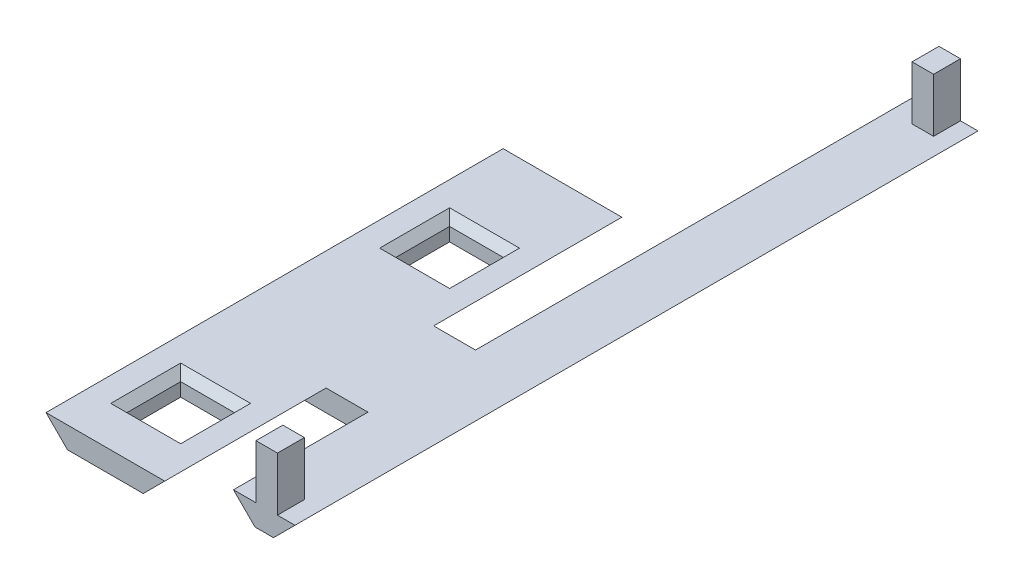
ISO-10303-21;
HEADER;
FILE_DESCRIPTION(('STEP AP214'),'2;1');
FILE_NAME('part.step','',(''),(''),'','','');
FILE_SCHEMA(('AUTOMOTIVE_DESIGN { 1 0 10303 214 1 1 1 1 }'));
ENDSEC;
DATA;
#1=APPLICATION_CONTEXT('core data for automotive mechanical design processes');
#2=APPLICATION_PROTOCOL_DEFINITION('international standard','automotive_design',2000,#1);
#3=PRODUCT_CONTEXT('',#1,'mechanical');
#4=PRODUCT('Part','Part','',(#3));
#5=PRODUCT_RELATED_PRODUCT_CATEGORY('part','',(#4));
#6=PRODUCT_DEFINITION_FORMATION('','',#4);
#7=PRODUCT_DEFINITION_CONTEXT('part definition',#1,'design');
#8=PRODUCT_DEFINITION('design','',#6,#7);
#9=PRODUCT_DEFINITION_SHAPE('','',#8);
#10=(LENGTH_UNIT() NAMED_UNIT(*) SI_UNIT(.MILLI.,.METRE.));
#11=(NAMED_UNIT(*) PLANE_ANGLE_UNIT() SI_UNIT($,.RADIAN.));
#12=(NAMED_UNIT(*) SI_UNIT($,.STERADIAN.) SOLID_ANGLE_UNIT());
#13=UNCERTAINTY_MEASURE_WITH_UNIT(LENGTH_MEASURE(1.E-05),#10,'distance_accuracy_value','');
#14=(GEOMETRIC_REPRESENTATION_CONTEXT(3) GLOBAL_UNCERTAINTY_ASSIGNED_CONTEXT((#13)) GLOBAL_UNIT_ASSIGNED_CONTEXT((#10,
#11,#12)) REPRESENTATION_CONTEXT('',''));
#15=CARTESIAN_POINT('',(0.,0.,0.));
#16=DIRECTION('',(0.,0.,1.));
#17=DIRECTION('',(1.,0.,0.));
#18=AXIS2_PLACEMENT_3D('',#15,#16,#17);
#19=CARTESIAN_POINT('',(0.,4.,85.));
#20=DIRECTION('',(0.,1.,0.));
#21=DIRECTION('',(-1.,0.,0.));
#22=AXIS2_PLACEMENT_3D('',#19,#20,#21);
#23=PLANE('',#22);
#24=DIRECTION('',(1.,0.,0.));
#25=VECTOR('',#24,1.);
#26=CARTESIAN_POINT('',(5.46065409578525,4.,14.5));
#27=LINE('',#26,#25);
#28=CARTESIAN_POINT('',(-6.03934590421478,4.,14.5));
#29=VERTEX_POINT('',#28);
#30=CARTESIAN_POINT('',(6.96065409578528,4.,14.5));
#31=VERTEX_POINT('',#30);
#32=EDGE_CURVE('E460',#29,#31,#27,.T.);
#33=ORIENTED_EDGE('',*,*,#32,.T.);
#34=DIRECTION('',(0.,0.,1.));
#35=VECTOR('',#34,1.);
#36=CARTESIAN_POINT('',(6.96065409578528,4.,26.));
#37=LINE('',#36,#35);
#38=CARTESIAN_POINT('',(6.96065409578528,4.,27.5));
#39=VERTEX_POINT('',#38);
#40=EDGE_CURVE('E462',#31,#39,#37,.T.);
#41=ORIENTED_EDGE('',*,*,#40,.T.);
#42=DIRECTION('',(-1.,0.,0.));
#43=VECTOR('',#42,1.);
#44=CARTESIAN_POINT('',(-4.53934590421476,4.,27.5));
#45=LINE('',#44,#43);
#46=CARTESIAN_POINT('',(-6.03934590421478,4.,27.5));
#47=VERTEX_POINT('',#46);
#48=EDGE_CURVE('E456',#39,#47,#45,.T.);
#49=ORIENTED_EDGE('',*,*,#48,.T.);
#50=DIRECTION('',(0.,0.,-1.));
#51=VECTOR('',#50,1.);
#52=CARTESIAN_POINT('',(-6.03934590421478,4.,16.));
#53=LINE('',#52,#51);
#54=EDGE_CURVE('E458',#47,#29,#53,.T.);
#55=ORIENTED_EDGE('',*,*,#54,.T.);
#56=EDGE_LOOP('',(#33,#41,#49,#55));
#57=FACE_BOUND('',#56,.T.);
#58=DIRECTION('',(0.,0.,-1.));
#59=VECTOR('',#58,1.);
#60=CARTESIAN_POINT('',(-6.03934590421478,4.,66.));
#61=LINE('',#60,#59);
#62=CARTESIAN_POINT('',(-6.03934590421478,4.,77.5));
#63=VERTEX_POINT('',#62);
#64=CARTESIAN_POINT('',(-6.03934590421478,4.,64.5));
#65=VERTEX_POINT('',#64);
#66=EDGE_CURVE('E447',#63,#65,#61,.T.);
#67=ORIENTED_EDGE('',*,*,#66,.T.);
#68=DIRECTION('',(1.,0.,0.));
#69=VECTOR('',#68,1.);
#70=CARTESIAN_POINT('',(5.46065409578524,4.,64.5));
#71=LINE('',#70,#69);
#72=CARTESIAN_POINT('',(6.96065409578526,4.,64.5));
#73=VERTEX_POINT('',#72);
#74=EDGE_CURVE('E453',#65,#73,#71,.T.);
#75=ORIENTED_EDGE('',*,*,#74,.T.);
#76=DIRECTION('',(0.,0.,1.));
#77=VECTOR('',#76,1.);
#78=CARTESIAN_POINT('',(6.96065409578525,4.,76.));
#79=LINE('',#78,#77);
#80=CARTESIAN_POINT('',(6.96065409578525,4.,77.5));
#81=VERTEX_POINT('',#80);
#82=EDGE_CURVE('E451',#73,#81,#79,.T.);
#83=ORIENTED_EDGE('',*,*,#82,.T.);
#84=DIRECTION('',(-1.,0.,0.));
#85=VECTOR('',#84,1.);
#86=CARTESIAN_POINT('',(-4.53934590421476,4.,77.5));
#87=LINE('',#86,#85);
#88=EDGE_CURVE('E449',#81,#63,#87,.T.);
#89=ORIENTED_EDGE('',*,*,#88,.T.);
#90=EDGE_LOOP('',(#67,#75,#83,#89));
#91=FACE_BOUND('',#90,.T.);
#92=DIRECTION('',(1.,0.,0.));
#93=VECTOR('',#92,1.);
#94=CARTESIAN_POINT('',(27.4606540957853,4.,-42.));
#95=LINE('',#94,#93);
#96=CARTESIAN_POINT('',(23.4606540957853,4.,-42.));
#97=VERTEX_POINT('',#96);
#98=CARTESIAN_POINT('',(27.4606540957853,4.,-42.));
#99=VERTEX_POINT('',#98);
#100=EDGE_CURVE('E961',#97,#99,#95,.T.);
#101=ORIENTED_EDGE('',*,*,#100,.F.);
#102=DIRECTION('',(0.,0.,1.));
#103=VECTOR('',#102,1.);
#104=CARTESIAN_POINT('',(23.4606540957853,4.,-42.));
#105=LINE('',#104,#103);
#106=CARTESIAN_POINT('',(23.4606540957853,4.,-47.));
#107=VERTEX_POINT('',#106);
#108=EDGE_CURVE('E275',#107,#97,#105,.T.);
#109=ORIENTED_EDGE('',*,*,#108,.F.);
#110=DIRECTION('',(1.,0.,0.));
#111=VECTOR('',#110,1.);
#112=CARTESIAN_POINT('',(0.,4.,-47.));
#113=LINE('',#112,#111);
#114=CARTESIAN_POINT('',(19.2828427124746,4.,-47.));
#115=VERTEX_POINT('',#114);
#116=EDGE_CURVE('E327',#115,#107,#113,.T.);
#117=ORIENTED_EDGE('',*,*,#116,.F.);
#118=DIRECTION('',(0.,0.,1.));
#119=VECTOR('',#118,1.);
#120=CARTESIAN_POINT('',(19.2828427124746,4.,-47.));
#121=LINE('',#120,#119);
#122=CARTESIAN_POINT('',(19.2828427124746,4.,35.));
#123=VERTEX_POINT('',#122);
#124=EDGE_CURVE('E344',#115,#123,#121,.T.);
#125=ORIENTED_EDGE('',*,*,#124,.T.);
#126=DIRECTION('',(1.,0.,0.));
#127=VECTOR('',#126,1.);
#128=CARTESIAN_POINT('',(7.5,4.,35.));
#129=LINE('',#128,#127);
#130=CARTESIAN_POINT('',(11.5,4.,35.));
#131=VERTEX_POINT('',#130);
#132=EDGE_CURVE('E356',#131,#123,#129,.T.);
#133=ORIENTED_EDGE('',*,*,#132,.F.);
#134=DIRECTION('',(0.,0.,-1.));
#135=VECTOR('',#134,1.);
#136=CARTESIAN_POINT('',(11.5,4.,85.));
#137=LINE('',#136,#135);
#138=CARTESIAN_POINT('',(11.5,4.,0.));
#139=VERTEX_POINT('',#138);
#140=EDGE_CURVE('E437',#131,#139,#137,.T.);
#141=ORIENTED_EDGE('',*,*,#140,.T.);
#142=DIRECTION('',(1.,0.,0.));
#143=VECTOR('',#142,1.);
#144=CARTESIAN_POINT('',(0.,4.,0.));
#145=LINE('',#144,#143);
#146=CARTESIAN_POINT('',(-10.5786918084295,4.,0.));
#147=VERTEX_POINT('',#146);
#148=EDGE_CURVE('E429',#147,#139,#145,.T.);
#149=ORIENTED_EDGE('',*,*,#148,.F.);
#150=DIRECTION('',(0.,0.,-1.));
#151=VECTOR('',#150,1.);
#152=CARTESIAN_POINT('',(-10.5786918084295,4.,85.));
#153=LINE('',#152,#151);
#154=CARTESIAN_POINT('',(-10.5786918084295,4.,85.));
#155=VERTEX_POINT('',#154);
#156=EDGE_CURVE('E435',#155,#147,#153,.T.);
#157=ORIENTED_EDGE('',*,*,#156,.F.);
#158=DIRECTION('',(1.,0.,0.));
#159=VECTOR('',#158,1.);
#160=CARTESIAN_POINT('',(0.,4.,85.));
#161=LINE('',#160,#159);
#162=CARTESIAN_POINT('',(11.5,4.,85.));
#163=VERTEX_POINT('',#162);
#164=EDGE_CURVE('E418',#155,#163,#161,.T.);
#165=ORIENTED_EDGE('',*,*,#164,.T.);
#166=CARTESIAN_POINT('',(11.5,4.,55.));
#167=VERTEX_POINT('',#166);
#168=EDGE_CURVE('E438',#163,#167,#137,.T.);
#169=ORIENTED_EDGE('',*,*,#168,.T.);
#170=DIRECTION('',(-1.,0.,0.));
#171=VECTOR('',#170,1.);
#172=CARTESIAN_POINT('',(7.5,4.,55.));
#173=LINE('',#172,#171);
#174=CARTESIAN_POINT('',(19.2828427124746,4.,55.));
#175=VERTEX_POINT('',#174);
#176=EDGE_CURVE('E358',#175,#167,#173,.T.);
#177=ORIENTED_EDGE('',*,*,#176,.F.);
#178=CARTESIAN_POINT('',(19.2828427124746,4.,80.));
#179=VERTEX_POINT('',#178);
#180=EDGE_CURVE('E347',#175,#179,#121,.T.);
#181=ORIENTED_EDGE('',*,*,#180,.T.);
#182=DIRECTION('',(1.,0.,0.));
#183=VECTOR('',#182,1.);
#184=CARTESIAN_POINT('',(0.,4.,80.));
#185=LINE('',#184,#183);
#186=CARTESIAN_POINT('',(23.4606540957853,4.,80.));
#187=VERTEX_POINT('',#186);
#188=EDGE_CURVE('E316',#179,#187,#185,.T.);
#189=ORIENTED_EDGE('',*,*,#188,.T.);
#190=DIRECTION('',(0.,0.,-1.));
#191=VECTOR('',#190,1.);
#192=CARTESIAN_POINT('',(23.4606540957853,4.,0.));
#193=LINE('',#192,#191);
#194=CARTESIAN_POINT('',(23.4606540957853,4.,75.));
#195=VERTEX_POINT('',#194);
#196=EDGE_CURVE('E290',#187,#195,#193,.T.);
#197=ORIENTED_EDGE('',*,*,#196,.T.);
#198=DIRECTION('',(1.,0.,0.));
#199=VECTOR('',#198,1.);
#200=CARTESIAN_POINT('',(0.,4.,75.));
#201=LINE('',#200,#199);
#202=CARTESIAN_POINT('',(27.4606540957853,4.,75.));
#203=VERTEX_POINT('',#202);
#204=EDGE_CURVE('E280',#195,#203,#201,.T.);
#205=ORIENTED_EDGE('',*,*,#204,.T.);
#206=DIRECTION('',(0.,0.,-1.));
#207=VECTOR('',#206,1.);
#208=CARTESIAN_POINT('',(27.4606540957853,4.,0.));
#209=LINE('',#208,#207);
#210=CARTESIAN_POINT('',(27.4606540957853,4.,80.));
#211=VERTEX_POINT('',#210);
#212=EDGE_CURVE('E277',#211,#203,#209,.T.);
#213=ORIENTED_EDGE('',*,*,#212,.F.);
#214=CARTESIAN_POINT('',(30.7171572875255,4.,80.));
#215=VERTEX_POINT('',#214);
#216=EDGE_CURVE('E315',#211,#215,#185,.T.);
#217=ORIENTED_EDGE('',*,*,#216,.T.);
#218=DIRECTION('',(0.,0.,1.));
#219=VECTOR('',#218,1.);
#220=CARTESIAN_POINT('',(30.7171572875255,4.,-47.));
#221=LINE('',#220,#219);
#222=CARTESIAN_POINT('',(30.7171572875255,4.,-47.));
#223=VERTEX_POINT('',#222);
#224=EDGE_CURVE('E336',#223,#215,#221,.T.);
#225=ORIENTED_EDGE('',*,*,#224,.F.);
#226=CARTESIAN_POINT('',(27.4606540957853,4.,-47.));
#227=VERTEX_POINT('',#226);
#228=EDGE_CURVE('E326',#227,#223,#113,.T.);
#229=ORIENTED_EDGE('',*,*,#228,.F.);
#230=DIRECTION('',(0.,0.,-1.));
#231=VECTOR('',#230,1.);
#232=CARTESIAN_POINT('',(27.4606540957853,4.,-42.));
#233=LINE('',#232,#231);
#234=EDGE_CURVE('E271',#99,#227,#233,.T.);
#235=ORIENTED_EDGE('',*,*,#234,.F.);
#236=EDGE_LOOP('',(#101,#109,#117,#125,#133,#141,#149,#157,#165,#169,#177,#181,#189,#197,#205,
#213,#217,#225,#229,#235));
#237=FACE_BOUND('',#236,.T.);
#238=ADVANCED_FACE('F43',(#57,#91,#237),#23,.T.);
#239=CARTESIAN_POINT('',(3.75000000000001,-3.75,85.));
#240=DIRECTION('',(-0.707106781186549,0.707106781186546,0.));
#241=DIRECTION('',(-0.707106781186546,-0.707106781186549,0.));
#242=AXIS2_PLACEMENT_3D('',#239,#240,#241);
#243=PLANE('',#242);
#244=DIRECTION('',(0.,0.,-1.));
#245=VECTOR('',#244,1.);
#246=CARTESIAN_POINT('',(7.5,0.,85.));
#247=LINE('',#246,#245);
#248=CARTESIAN_POINT('',(7.5,0.,85.));
#249=VERTEX_POINT('',#248);
#250=CARTESIAN_POINT('',(7.5,0.,55.));
#251=VERTEX_POINT('',#250);
#252=EDGE_CURVE('E442',#249,#251,#247,.T.);
#253=ORIENTED_EDGE('',*,*,#252,.T.);
#254=DIRECTION('',(0.707106781186546,0.707106781186549,0.));
#255=VECTOR('',#254,1.);
#256=CARTESIAN_POINT('',(3.75000000000001,-3.75,55.));
#257=LINE('',#256,#255);
#258=EDGE_CURVE('E368',#251,#167,#257,.T.);
#259=ORIENTED_EDGE('',*,*,#258,.T.);
#260=ORIENTED_EDGE('',*,*,#168,.F.);
#261=DIRECTION('',(0.707106781186546,0.707106781186549,0.));
#262=VECTOR('',#261,1.);
#263=CARTESIAN_POINT('',(3.75000000000001,-3.75,85.));
#264=LINE('',#263,#262);
#265=EDGE_CURVE('E415',#249,#163,#264,.T.);
#266=ORIENTED_EDGE('',*,*,#265,.F.);
#267=EDGE_LOOP('',(#253,#259,#260,#266));
#268=FACE_BOUND('',#267,.T.);
#269=ADVANCED_FACE('F539',(#268),#243,.F.);
#270=CARTESIAN_POINT('',(0.,0.,85.));
#271=DIRECTION('',(0.,-1.,0.));
#272=DIRECTION('',(0.,0.,-1.));
#273=AXIS2_PLACEMENT_3D('',#270,#271,#272);
#274=PLANE('',#273);
#275=DIRECTION('',(0.,0.,1.));
#276=VECTOR('',#275,1.);
#277=CARTESIAN_POINT('',(5.46065409578525,0.,26.));
#278=LINE('',#277,#276);
#279=CARTESIAN_POINT('',(5.46065409578525,0.,16.));
#280=VERTEX_POINT('',#279);
#281=CARTESIAN_POINT('',(5.46065409578525,0.,26.));
#282=VERTEX_POINT('',#281);
#283=EDGE_CURVE('E372',#280,#282,#278,.T.);
#284=ORIENTED_EDGE('',*,*,#283,.F.);
#285=DIRECTION('',(1.,0.,0.));
#286=VECTOR('',#285,1.);
#287=CARTESIAN_POINT('',(-4.53934590421475,0.,16.));
#288=LINE('',#287,#286);
#289=CARTESIAN_POINT('',(-4.53934590421475,0.,16.));
#290=VERTEX_POINT('',#289);
#291=EDGE_CURVE('E382',#290,#280,#288,.T.);
#292=ORIENTED_EDGE('',*,*,#291,.F.);
#293=DIRECTION('',(0.,0.,-1.));
#294=VECTOR('',#293,1.);
#295=CARTESIAN_POINT('',(-4.53934590421476,0.,26.));
#296=LINE('',#295,#294);
#297=CARTESIAN_POINT('',(-4.53934590421476,0.,26.));
#298=VERTEX_POINT('',#297);
#299=EDGE_CURVE('E379',#298,#290,#296,.T.);
#300=ORIENTED_EDGE('',*,*,#299,.F.);
#301=DIRECTION('',(-1.,0.,0.));
#302=VECTOR('',#301,1.);
#303=CARTESIAN_POINT('',(-4.53934590421476,0.,26.));
#304=LINE('',#303,#302);
#305=EDGE_CURVE('E375',#282,#298,#304,.T.);
#306=ORIENTED_EDGE('',*,*,#305,.F.);
#307=EDGE_LOOP('',(#284,#292,#300,#306));
#308=FACE_BOUND('',#307,.T.);
#309=DIRECTION('',(0.,0.,1.));
#310=VECTOR('',#309,1.);
#311=CARTESIAN_POINT('',(5.46065409578524,0.,76.));
#312=LINE('',#311,#310);
#313=CARTESIAN_POINT('',(5.46065409578524,0.,66.));
#314=VERTEX_POINT('',#313);
#315=CARTESIAN_POINT('',(5.46065409578524,0.,76.));
#316=VERTEX_POINT('',#315);
#317=EDGE_CURVE('E376',#314,#316,#312,.T.);
#318=ORIENTED_EDGE('',*,*,#317,.F.);
#319=DIRECTION('',(1.,0.,0.));
#320=VECTOR('',#319,1.);
#321=CARTESIAN_POINT('',(-4.53934590421476,0.,66.));
#322=LINE('',#321,#320);
#323=CARTESIAN_POINT('',(-4.53934590421476,0.,66.));
#324=VERTEX_POINT('',#323);
#325=EDGE_CURVE('E396',#324,#314,#322,.T.);
#326=ORIENTED_EDGE('',*,*,#325,.F.);
#327=DIRECTION('',(0.,0.,-1.));
#328=VECTOR('',#327,1.);
#329=CARTESIAN_POINT('',(-4.53934590421476,0.,76.));
#330=LINE('',#329,#328);
#331=CARTESIAN_POINT('',(-4.53934590421476,0.,76.));
#332=VERTEX_POINT('',#331);
#333=EDGE_CURVE('E404',#332,#324,#330,.T.);
#334=ORIENTED_EDGE('',*,*,#333,.F.);
#335=DIRECTION('',(-1.,0.,0.));
#336=VECTOR('',#335,1.);
#337=CARTESIAN_POINT('',(-4.53934590421476,0.,76.));
#338=LINE('',#337,#336);
#339=EDGE_CURVE('E407',#316,#332,#338,.T.);
#340=ORIENTED_EDGE('',*,*,#339,.F.);
#341=EDGE_LOOP('',(#318,#326,#334,#340));
#342=FACE_BOUND('',#341,.T.);
#343=DIRECTION('',(-1.,0.,0.));
#344=VECTOR('',#343,1.);
#345=CARTESIAN_POINT('',(0.,0.,0.));
#346=LINE('',#345,#344);
#347=CARTESIAN_POINT('',(7.5,0.,0.));
#348=VERTEX_POINT('',#347);
#349=CARTESIAN_POINT('',(-6.57869180842953,0.,0.));
#350=VERTEX_POINT('',#349);
#351=EDGE_CURVE('E388',#348,#350,#346,.T.);
#352=ORIENTED_EDGE('',*,*,#351,.F.);
#353=CARTESIAN_POINT('',(7.5,0.,35.));
#354=VERTEX_POINT('',#353);
#355=EDGE_CURVE('E441',#354,#348,#247,.T.);
#356=ORIENTED_EDGE('',*,*,#355,.F.);
#357=DIRECTION('',(1.,0.,0.));
#358=VECTOR('',#357,1.);
#359=CARTESIAN_POINT('',(7.5,0.,35.));
#360=LINE('',#359,#358);
#361=CARTESIAN_POINT('',(23.2828427124746,0.,35.));
#362=VERTEX_POINT('',#361);
#363=EDGE_CURVE('E355',#354,#362,#360,.T.);
#364=ORIENTED_EDGE('',*,*,#363,.T.);
#365=DIRECTION('',(0.,0.,1.));
#366=VECTOR('',#365,1.);
#367=CARTESIAN_POINT('',(23.2828427124746,0.,-47.));
#368=LINE('',#367,#366);
#369=CARTESIAN_POINT('',(23.2828427124746,0.,-47.));
#370=VERTEX_POINT('',#369);
#371=EDGE_CURVE('E340',#370,#362,#368,.T.);
#372=ORIENTED_EDGE('',*,*,#371,.F.);
#373=DIRECTION('',(1.,0.,0.));
#374=VECTOR('',#373,1.);
#375=CARTESIAN_POINT('',(0.,0.,-47.));
#376=LINE('',#375,#374);
#377=CARTESIAN_POINT('',(26.7171572875255,0.,-47.));
#378=VERTEX_POINT('',#377);
#379=EDGE_CURVE('E333',#370,#378,#376,.T.);
#380=ORIENTED_EDGE('',*,*,#379,.T.);
#381=DIRECTION('',(0.,0.,1.));
#382=VECTOR('',#381,1.);
#383=CARTESIAN_POINT('',(26.7171572875255,0.,-47.));
#384=LINE('',#383,#382);
#385=CARTESIAN_POINT('',(26.7171572875255,0.,80.));
#386=VERTEX_POINT('',#385);
#387=EDGE_CURVE('E337',#378,#386,#384,.T.);
#388=ORIENTED_EDGE('',*,*,#387,.T.);
#389=DIRECTION('',(1.,0.,0.));
#390=VECTOR('',#389,1.);
#391=CARTESIAN_POINT('',(0.,0.,80.));
#392=LINE('',#391,#390);
#393=CARTESIAN_POINT('',(23.2828427124746,0.,80.));
#394=VERTEX_POINT('',#393);
#395=EDGE_CURVE('E321',#394,#386,#392,.T.);
#396=ORIENTED_EDGE('',*,*,#395,.F.);
#397=CARTESIAN_POINT('',(23.2828427124746,0.,55.));
#398=VERTEX_POINT('',#397);
#399=EDGE_CURVE('E343',#398,#394,#368,.T.);
#400=ORIENTED_EDGE('',*,*,#399,.F.);
#401=DIRECTION('',(-1.,0.,0.));
#402=VECTOR('',#401,1.);
#403=CARTESIAN_POINT('',(7.5,0.,55.));
#404=LINE('',#403,#402);
#405=EDGE_CURVE('E359',#398,#251,#404,.T.);
#406=ORIENTED_EDGE('',*,*,#405,.T.);
#407=ORIENTED_EDGE('',*,*,#252,.F.);
#408=DIRECTION('',(-1.,0.,0.));
#409=VECTOR('',#408,1.);
#410=CARTESIAN_POINT('',(0.,0.,85.));
#411=LINE('',#410,#409);
#412=CARTESIAN_POINT('',(-6.57869180842953,0.,85.));
#413=VERTEX_POINT('',#412);
#414=EDGE_CURVE('E412',#249,#413,#411,.T.);
#415=ORIENTED_EDGE('',*,*,#414,.T.);
#416=DIRECTION('',(0.,0.,-1.));
#417=VECTOR('',#416,1.);
#418=CARTESIAN_POINT('',(-6.57869180842953,0.,85.));
#419=LINE('',#418,#417);
#420=EDGE_CURVE('E423',#413,#350,#419,.T.);
#421=ORIENTED_EDGE('',*,*,#420,.T.);
#422=EDGE_LOOP('',(#352,#356,#364,#372,#380,#388,#396,#400,#406,#407,#415,#421));
#423=FACE_BOUND('',#422,.T.);
#424=ADVANCED_FACE('F521',(#308,#342,#423),#274,.T.);
#425=ORIENTED_EDGE('',*,*,#140,.F.);
#426=DIRECTION('',(-0.707106781186546,-0.707106781186549,0.));
#427=VECTOR('',#426,1.);
#428=CARTESIAN_POINT('',(3.75000000000001,-3.75,35.));
#429=LINE('',#428,#427);
#430=EDGE_CURVE('E361',#131,#354,#429,.T.);
#431=ORIENTED_EDGE('',*,*,#430,.T.);
#432=ORIENTED_EDGE('',*,*,#355,.T.);
#433=DIRECTION('',(0.707106781186546,0.707106781186549,0.));
#434=VECTOR('',#433,1.);
#435=CARTESIAN_POINT('',(3.75000000000001,-3.75,0.));
#436=LINE('',#435,#434);
#437=EDGE_CURVE('E426',#348,#139,#436,.T.);
#438=ORIENTED_EDGE('',*,*,#437,.T.);
#439=EDGE_LOOP('',(#425,#431,#432,#438));
#440=FACE_BOUND('',#439,.T.);
#441=ADVANCED_FACE('F549',(#440),#243,.F.);
#442=CARTESIAN_POINT('',(-3.28934590421477,-3.28934590421476,85.));
#443=DIRECTION('',(0.707106781186549,0.707106781186546,0.));
#444=DIRECTION('',(-0.707106781186546,0.707106781186549,0.));
#445=AXIS2_PLACEMENT_3D('',#442,#443,#444);
#446=PLANE('',#445);
#447=DIRECTION('',(0.707106781186546,-0.707106781186549,0.));
#448=VECTOR('',#447,1.);
#449=CARTESIAN_POINT('',(-3.28934590421477,-3.28934590421476,0.));
#450=LINE('',#449,#448);
#451=EDGE_CURVE('E416',#147,#350,#450,.T.);
#452=ORIENTED_EDGE('',*,*,#451,.T.);
#453=ORIENTED_EDGE('',*,*,#420,.F.);
#454=DIRECTION('',(0.707106781186546,-0.707106781186549,0.));
#455=VECTOR('',#454,1.);
#456=CARTESIAN_POINT('',(-3.28934590421477,-3.28934590421476,85.));
#457=LINE('',#456,#455);
#458=EDGE_CURVE('E421',#155,#413,#457,.T.);
#459=ORIENTED_EDGE('',*,*,#458,.F.);
#460=ORIENTED_EDGE('',*,*,#156,.T.);
#461=EDGE_LOOP('',(#452,#453,#459,#460));
#462=FACE_BOUND('',#461,.T.);
#463=ADVANCED_FACE('F551',(#462),#446,.F.);
#464=CARTESIAN_POINT('',(0.,0.,85.));
#465=DIRECTION('',(0.,0.,1.));
#466=DIRECTION('',(1.,0.,0.));
#467=AXIS2_PLACEMENT_3D('',#464,#465,#466);
#468=PLANE('',#467);
#469=ORIENTED_EDGE('',*,*,#414,.F.);
#470=ORIENTED_EDGE('',*,*,#265,.T.);
#471=ORIENTED_EDGE('',*,*,#164,.F.);
#472=ORIENTED_EDGE('',*,*,#458,.T.);
#473=EDGE_LOOP('',(#469,#470,#471,#472));
#474=FACE_BOUND('',#473,.T.);
#475=ADVANCED_FACE('F694',(#474),#468,.T.);
#476=CARTESIAN_POINT('',(0.,0.,0.));
#477=DIRECTION('',(0.,0.,1.));
#478=DIRECTION('',(1.,0.,0.));
#479=AXIS2_PLACEMENT_3D('',#476,#477,#478);
#480=PLANE('',#479);
#481=ORIENTED_EDGE('',*,*,#351,.T.);
#482=ORIENTED_EDGE('',*,*,#451,.F.);
#483=ORIENTED_EDGE('',*,*,#148,.T.);
#484=ORIENTED_EDGE('',*,*,#437,.F.);
#485=EDGE_LOOP('',(#481,#482,#483,#484));
#486=FACE_BOUND('',#485,.T.);
#487=ADVANCED_FACE('F686',(#486),#480,.F.);
#488=CARTESIAN_POINT('',(5.46065409578524,80.,76.));
#489=DIRECTION('',(1.,0.,0.));
#490=DIRECTION('',(0.,0.,-1.));
#491=AXIS2_PLACEMENT_3D('',#488,#489,#490);
#492=PLANE('',#491);
#493=DIRECTION('',(0.,-1.,0.));
#494=VECTOR('',#493,1.);
#495=CARTESIAN_POINT('',(5.46065409578524,80.,76.));
#496=LINE('',#495,#494);
#497=CARTESIAN_POINT('',(5.46065409578524,2.49999999999999,76.));
#498=VERTEX_POINT('',#497);
#499=EDGE_CURVE('E394',#498,#316,#496,.T.);
#500=ORIENTED_EDGE('',*,*,#499,.F.);
#501=DIRECTION('',(0.,0.,-1.));
#502=VECTOR('',#501,1.);
#503=CARTESIAN_POINT('',(5.46065409578524,2.49999999999999,66.));
#504=LINE('',#503,#502);
#505=CARTESIAN_POINT('',(5.46065409578524,2.49999999999999,66.));
#506=VERTEX_POINT('',#505);
#507=EDGE_CURVE('E474',#498,#506,#504,.T.);
#508=ORIENTED_EDGE('',*,*,#507,.T.);
#509=DIRECTION('',(0.,-1.,0.));
#510=VECTOR('',#509,1.);
#511=CARTESIAN_POINT('',(5.46065409578524,80.,66.));
#512=LINE('',#511,#510);
#513=EDGE_CURVE('E371',#506,#314,#512,.T.);
#514=ORIENTED_EDGE('',*,*,#513,.T.);
#515=ORIENTED_EDGE('',*,*,#317,.T.);
#516=EDGE_LOOP('',(#500,#508,#514,#515));
#517=FACE_BOUND('',#516,.T.);
#518=ADVANCED_FACE('F524',(#517),#492,.F.);
#519=CARTESIAN_POINT('',(-4.53934590421476,80.,66.));
#520=DIRECTION('',(0.,0.,-1.));
#521=DIRECTION('',(-1.,0.,0.));
#522=AXIS2_PLACEMENT_3D('',#519,#520,#521);
#523=PLANE('',#522);
#524=ORIENTED_EDGE('',*,*,#513,.F.);
#525=DIRECTION('',(-1.,0.,0.));
#526=VECTOR('',#525,1.);
#527=CARTESIAN_POINT('',(-4.53934590421476,2.49999999999999,66.));
#528=LINE('',#527,#526);
#529=CARTESIAN_POINT('',(-4.53934590421476,2.49999999999999,66.));
#530=VERTEX_POINT('',#529);
#531=EDGE_CURVE('E471',#506,#530,#528,.T.);
#532=ORIENTED_EDGE('',*,*,#531,.T.);
#533=DIRECTION('',(0.,-1.,0.));
#534=VECTOR('',#533,1.);
#535=CARTESIAN_POINT('',(-4.53934590421476,80.,66.));
#536=LINE('',#535,#534);
#537=EDGE_CURVE('E399',#530,#324,#536,.T.);
#538=ORIENTED_EDGE('',*,*,#537,.T.);
#539=ORIENTED_EDGE('',*,*,#325,.T.);
#540=EDGE_LOOP('',(#524,#532,#538,#539));
#541=FACE_BOUND('',#540,.T.);
#542=ADVANCED_FACE('F514',(#541),#523,.F.);
#543=CARTESIAN_POINT('',(-4.53934590421476,80.,76.));
#544=DIRECTION('',(-1.,0.,0.));
#545=DIRECTION('',(0.,0.,1.));
#546=AXIS2_PLACEMENT_3D('',#543,#544,#545);
#547=PLANE('',#546);
#548=ORIENTED_EDGE('',*,*,#537,.F.);
#549=DIRECTION('',(0.,0.,1.));
#550=VECTOR('',#549,1.);
#551=CARTESIAN_POINT('',(-4.53934590421476,2.49999999999999,76.));
#552=LINE('',#551,#550);
#553=CARTESIAN_POINT('',(-4.53934590421476,2.49999999999999,76.));
#554=VERTEX_POINT('',#553);
#555=EDGE_CURVE('E11',#530,#554,#552,.T.);
#556=ORIENTED_EDGE('',*,*,#555,.T.);
#557=DIRECTION('',(0.,-1.,0.));
#558=VECTOR('',#557,1.);
#559=CARTESIAN_POINT('',(-4.53934590421476,80.,76.));
#560=LINE('',#559,#558);
#561=EDGE_CURVE('E397',#554,#332,#560,.T.);
#562=ORIENTED_EDGE('',*,*,#561,.T.);
#563=ORIENTED_EDGE('',*,*,#333,.T.);
#564=EDGE_LOOP('',(#548,#556,#562,#563));
#565=FACE_BOUND('',#564,.T.);
#566=ADVANCED_FACE('F515',(#565),#547,.F.);
#567=CARTESIAN_POINT('',(-4.53934590421476,80.,76.));
#568=DIRECTION('',(0.,0.,1.));
#569=DIRECTION('',(1.,0.,0.));
#570=AXIS2_PLACEMENT_3D('',#567,#568,#569);
#571=PLANE('',#570);
#572=ORIENTED_EDGE('',*,*,#561,.F.);
#573=DIRECTION('',(1.,0.,0.));
#574=VECTOR('',#573,1.);
#575=CARTESIAN_POINT('',(5.46065409578524,2.49999999999999,76.));
#576=LINE('',#575,#574);
#577=EDGE_CURVE('E53',#554,#498,#576,.T.);
#578=ORIENTED_EDGE('',*,*,#577,.T.);
#579=ORIENTED_EDGE('',*,*,#499,.T.);
#580=ORIENTED_EDGE('',*,*,#339,.T.);
#581=EDGE_LOOP('',(#572,#578,#579,#580));
#582=FACE_BOUND('',#581,.T.);
#583=ADVANCED_FACE('F525',(#582),#571,.F.);
#584=CARTESIAN_POINT('',(5.46065409578525,80.,26.));
#585=DIRECTION('',(1.,0.,0.));
#586=DIRECTION('',(0.,0.,-1.));
#587=AXIS2_PLACEMENT_3D('',#584,#585,#586);
#588=PLANE('',#587);
#589=DIRECTION('',(0.,-1.,0.));
#590=VECTOR('',#589,1.);
#591=CARTESIAN_POINT('',(5.46065409578525,80.,26.));
#592=LINE('',#591,#590);
#593=CARTESIAN_POINT('',(5.46065409578525,2.49999999999996,26.));
#594=VERTEX_POINT('',#593);
#595=EDGE_CURVE('E385',#594,#282,#592,.T.);
#596=ORIENTED_EDGE('',*,*,#595,.F.);
#597=DIRECTION('',(0.,0.,-1.));
#598=VECTOR('',#597,1.);
#599=CARTESIAN_POINT('',(5.46065409578525,2.49999999999996,16.));
#600=LINE('',#599,#598);
#601=CARTESIAN_POINT('',(5.46065409578525,2.49999999999996,16.));
#602=VERTEX_POINT('',#601);
#603=EDGE_CURVE('E444',#594,#602,#600,.T.);
#604=ORIENTED_EDGE('',*,*,#603,.T.);
#605=DIRECTION('',(0.,-1.,0.));
#606=VECTOR('',#605,1.);
#607=CARTESIAN_POINT('',(5.46065409578525,80.,16.));
#608=LINE('',#607,#606);
#609=EDGE_CURVE('E386',#602,#280,#608,.T.);
#610=ORIENTED_EDGE('',*,*,#609,.T.);
#611=ORIENTED_EDGE('',*,*,#283,.T.);
#612=EDGE_LOOP('',(#596,#604,#610,#611));
#613=FACE_BOUND('',#612,.T.);
#614=ADVANCED_FACE('F527',(#613),#588,.F.);
#615=CARTESIAN_POINT('',(-4.53934590421475,80.,16.));
#616=DIRECTION('',(0.,0.,-1.));
#617=DIRECTION('',(-1.,0.,0.));
#618=AXIS2_PLACEMENT_3D('',#615,#616,#617);
#619=PLANE('',#618);
#620=ORIENTED_EDGE('',*,*,#609,.F.);
#621=DIRECTION('',(-1.,0.,0.));
#622=VECTOR('',#621,1.);
#623=CARTESIAN_POINT('',(-4.53934590421475,2.49999999999996,16.));
#624=LINE('',#623,#622);
#625=CARTESIAN_POINT('',(-4.53934590421475,2.49999999999996,16.));
#626=VERTEX_POINT('',#625);
#627=EDGE_CURVE('E465',#602,#626,#624,.T.);
#628=ORIENTED_EDGE('',*,*,#627,.T.);
#629=DIRECTION('',(0.,-1.,0.));
#630=VECTOR('',#629,1.);
#631=CARTESIAN_POINT('',(-4.53934590421475,80.,16.));
#632=LINE('',#631,#630);
#633=EDGE_CURVE('E389',#626,#290,#632,.T.);
#634=ORIENTED_EDGE('',*,*,#633,.T.);
#635=ORIENTED_EDGE('',*,*,#291,.T.);
#636=EDGE_LOOP('',(#620,#628,#634,#635));
#637=FACE_BOUND('',#636,.T.);
#638=ADVANCED_FACE('F533',(#637),#619,.F.);
#639=CARTESIAN_POINT('',(-4.53934590421476,80.,26.));
#640=DIRECTION('',(-1.,0.,0.));
#641=DIRECTION('',(0.,0.,1.));
#642=AXIS2_PLACEMENT_3D('',#639,#640,#641);
#643=PLANE('',#642);
#644=ORIENTED_EDGE('',*,*,#633,.F.);
#645=DIRECTION('',(0.,0.,1.));
#646=VECTOR('',#645,1.);
#647=CARTESIAN_POINT('',(-4.53934590421476,2.49999999999996,26.));
#648=LINE('',#647,#646);
#649=CARTESIAN_POINT('',(-4.53934590421476,2.49999999999996,26.));
#650=VERTEX_POINT('',#649);
#651=EDGE_CURVE('E467',#626,#650,#648,.T.);
#652=ORIENTED_EDGE('',*,*,#651,.T.);
#653=DIRECTION('',(0.,-1.,0.));
#654=VECTOR('',#653,1.);
#655=CARTESIAN_POINT('',(-4.53934590421476,80.,26.));
#656=LINE('',#655,#654);
#657=EDGE_CURVE('E391',#650,#298,#656,.T.);
#658=ORIENTED_EDGE('',*,*,#657,.T.);
#659=ORIENTED_EDGE('',*,*,#299,.T.);
#660=EDGE_LOOP('',(#644,#652,#658,#659));
#661=FACE_BOUND('',#660,.T.);
#662=ADVANCED_FACE('F635',(#661),#643,.F.);
#663=CARTESIAN_POINT('',(-4.53934590421476,80.,26.));
#664=DIRECTION('',(0.,0.,1.));
#665=DIRECTION('',(1.,0.,0.));
#666=AXIS2_PLACEMENT_3D('',#663,#664,#665);
#667=PLANE('',#666);
#668=ORIENTED_EDGE('',*,*,#657,.F.);
#669=DIRECTION('',(1.,0.,0.));
#670=VECTOR('',#669,1.);
#671=CARTESIAN_POINT('',(5.46065409578525,2.49999999999996,26.));
#672=LINE('',#671,#670);
#673=EDGE_CURVE('E469',#650,#594,#672,.T.);
#674=ORIENTED_EDGE('',*,*,#673,.T.);
#675=ORIENTED_EDGE('',*,*,#595,.T.);
#676=ORIENTED_EDGE('',*,*,#305,.T.);
#677=EDGE_LOOP('',(#668,#674,#675,#676));
#678=FACE_BOUND('',#677,.T.);
#679=ADVANCED_FACE('F630',(#678),#667,.F.);
#680=CARTESIAN_POINT('',(7.5,4.,55.));
#681=DIRECTION('',(0.,0.,1.));
#682=DIRECTION('',(1.,0.,0.));
#683=AXIS2_PLACEMENT_3D('',#680,#681,#682);
#684=PLANE('',#683);
#685=DIRECTION('',(0.70710678118655,-0.707106781186545,0.));
#686=VECTOR('',#685,1.);
#687=CARTESIAN_POINT('',(13.3914213562373,9.8914213562373,55.));
#688=LINE('',#687,#686);
#689=EDGE_CURVE('E352',#175,#398,#688,.T.);
#690=ORIENTED_EDGE('',*,*,#689,.F.);
#691=ORIENTED_EDGE('',*,*,#176,.T.);
#692=ORIENTED_EDGE('',*,*,#258,.F.);
#693=ORIENTED_EDGE('',*,*,#405,.F.);
#694=EDGE_LOOP('',(#690,#691,#692,#693));
#695=FACE_BOUND('',#694,.T.);
#696=ADVANCED_FACE('F634',(#695),#684,.T.);
#697=CARTESIAN_POINT('',(7.5,4.,35.));
#698=DIRECTION('',(0.,0.,-1.));
#699=DIRECTION('',(-1.,0.,0.));
#700=AXIS2_PLACEMENT_3D('',#697,#698,#699);
#701=PLANE('',#700);
#702=DIRECTION('',(-0.70710678118655,0.707106781186545,0.));
#703=VECTOR('',#702,1.);
#704=CARTESIAN_POINT('',(13.3914213562373,9.8914213562373,35.));
#705=LINE('',#704,#703);
#706=EDGE_CURVE('E339',#362,#123,#705,.T.);
#707=ORIENTED_EDGE('',*,*,#706,.F.);
#708=ORIENTED_EDGE('',*,*,#363,.F.);
#709=ORIENTED_EDGE('',*,*,#430,.F.);
#710=ORIENTED_EDGE('',*,*,#132,.T.);
#711=EDGE_LOOP('',(#707,#708,#709,#710));
#712=FACE_BOUND('',#711,.T.);
#713=ADVANCED_FACE('F723',(#712),#701,.T.);
#714=CARTESIAN_POINT('',(11.6414213562372,11.6414213562373,-47.));
#715=DIRECTION('',(-0.707106781186545,-0.70710678118655,0.));
#716=DIRECTION('',(0.70710678118655,-0.707106781186545,0.));
#717=AXIS2_PLACEMENT_3D('',#714,#715,#716);
#718=PLANE('',#717);
#719=ORIENTED_EDGE('',*,*,#180,.F.);
#720=ORIENTED_EDGE('',*,*,#689,.T.);
#721=ORIENTED_EDGE('',*,*,#399,.T.);
#722=DIRECTION('',(0.70710678118655,-0.707106781186545,0.));
#723=VECTOR('',#722,1.);
#724=CARTESIAN_POINT('',(11.6414213562372,11.6414213562373,80.));
#725=LINE('',#724,#723);
#726=EDGE_CURVE('E318',#179,#394,#725,.T.);
#727=ORIENTED_EDGE('',*,*,#726,.F.);
#728=EDGE_LOOP('',(#719,#720,#721,#727));
#729=FACE_BOUND('',#728,.T.);
#730=ADVANCED_FACE('F732',(#729),#718,.T.);
#731=CARTESIAN_POINT('',(13.3585786437626,-13.3585786437627,-47.));
#732=DIRECTION('',(-0.707106781186545,0.70710678118655,0.));
#733=DIRECTION('',(-0.70710678118655,-0.707106781186545,0.));
#734=AXIS2_PLACEMENT_3D('',#731,#732,#733);
#735=PLANE('',#734);
#736=ORIENTED_EDGE('',*,*,#224,.T.);
#737=DIRECTION('',(-0.70710678118655,-0.707106781186545,0.));
#738=VECTOR('',#737,1.);
#739=CARTESIAN_POINT('',(13.3585786437626,-13.3585786437627,80.));
#740=LINE('',#739,#738);
#741=EDGE_CURVE('E312',#215,#386,#740,.T.);
#742=ORIENTED_EDGE('',*,*,#741,.T.);
#743=ORIENTED_EDGE('',*,*,#387,.F.);
#744=DIRECTION('',(-0.70710678118655,-0.707106781186545,0.));
#745=VECTOR('',#744,1.);
#746=CARTESIAN_POINT('',(13.3585786437626,-13.3585786437627,-47.));
#747=LINE('',#746,#745);
#748=EDGE_CURVE('E324',#223,#378,#747,.T.);
#749=ORIENTED_EDGE('',*,*,#748,.F.);
#750=EDGE_LOOP('',(#736,#742,#743,#749));
#751=FACE_BOUND('',#750,.T.);
#752=ADVANCED_FACE('F742',(#751),#735,.F.);
#753=ORIENTED_EDGE('',*,*,#371,.T.);
#754=ORIENTED_EDGE('',*,*,#706,.T.);
#755=ORIENTED_EDGE('',*,*,#124,.F.);
#756=DIRECTION('',(0.70710678118655,-0.707106781186545,0.));
#757=VECTOR('',#756,1.);
#758=CARTESIAN_POINT('',(11.6414213562372,11.6414213562373,-47.));
#759=LINE('',#758,#757);
#760=EDGE_CURVE('E330',#115,#370,#759,.T.);
#761=ORIENTED_EDGE('',*,*,#760,.T.);
#762=EDGE_LOOP('',(#753,#754,#755,#761));
#763=FACE_BOUND('',#762,.T.);
#764=ADVANCED_FACE('F745',(#763),#718,.T.);
#765=CARTESIAN_POINT('',(0.,0.,-47.));
#766=DIRECTION('',(0.,0.,1.));
#767=DIRECTION('',(1.,0.,0.));
#768=AXIS2_PLACEMENT_3D('',#765,#766,#767);
#769=PLANE('',#768);
#770=ORIENTED_EDGE('',*,*,#748,.T.);
#771=ORIENTED_EDGE('',*,*,#379,.F.);
#772=ORIENTED_EDGE('',*,*,#760,.F.);
#773=ORIENTED_EDGE('',*,*,#116,.T.);
#774=DIRECTION('',(0.,-1.,0.));
#775=VECTOR('',#774,1.);
#776=CARTESIAN_POINT('',(23.4606540957853,14.,-47.));
#777=LINE('',#776,#775);
#778=CARTESIAN_POINT('',(23.4606540957853,14.,-47.));
#779=VERTEX_POINT('',#778);
#780=EDGE_CURVE('E960',#779,#107,#777,.T.);
#781=ORIENTED_EDGE('',*,*,#780,.F.);
#782=DIRECTION('',(-1.,0.,0.));
#783=VECTOR('',#782,1.);
#784=CARTESIAN_POINT('',(27.4606540957853,14.,-47.));
#785=LINE('',#784,#783);
#786=CARTESIAN_POINT('',(27.4606540957853,14.,-47.));
#787=VERTEX_POINT('',#786);
#788=EDGE_CURVE('E268',#787,#779,#785,.T.);
#789=ORIENTED_EDGE('',*,*,#788,.F.);
#790=DIRECTION('',(0.,-1.,0.));
#791=VECTOR('',#790,1.);
#792=CARTESIAN_POINT('',(27.4606540957853,14.,-47.));
#793=LINE('',#792,#791);
#794=EDGE_CURVE('E282',#787,#227,#793,.T.);
#795=ORIENTED_EDGE('',*,*,#794,.T.);
#796=ORIENTED_EDGE('',*,*,#228,.T.);
#797=EDGE_LOOP('',(#770,#771,#772,#773,#781,#789,#795,#796));
#798=FACE_BOUND('',#797,.T.);
#799=ADVANCED_FACE('F758',(#798),#769,.F.);
#800=CARTESIAN_POINT('',(0.,0.,80.));
#801=DIRECTION('',(0.,0.,1.));
#802=DIRECTION('',(1.,0.,0.));
#803=AXIS2_PLACEMENT_3D('',#800,#801,#802);
#804=PLANE('',#803);
#805=ORIENTED_EDGE('',*,*,#741,.F.);
#806=ORIENTED_EDGE('',*,*,#216,.F.);
#807=DIRECTION('',(0.,-1.,0.));
#808=VECTOR('',#807,1.);
#809=CARTESIAN_POINT('',(27.4606540957853,14.,80.));
#810=LINE('',#809,#808);
#811=CARTESIAN_POINT('',(27.4606540957853,14.,80.));
#812=VERTEX_POINT('',#811);
#813=EDGE_CURVE('E309',#812,#211,#810,.T.);
#814=ORIENTED_EDGE('',*,*,#813,.F.);
#815=DIRECTION('',(1.,0.,0.));
#816=VECTOR('',#815,1.);
#817=CARTESIAN_POINT('',(0.,14.,80.));
#818=LINE('',#817,#816);
#819=CARTESIAN_POINT('',(23.4606540957853,14.,80.));
#820=VERTEX_POINT('',#819);
#821=EDGE_CURVE('E286',#820,#812,#818,.T.);
#822=ORIENTED_EDGE('',*,*,#821,.F.);
#823=DIRECTION('',(0.,-1.,0.));
#824=VECTOR('',#823,1.);
#825=CARTESIAN_POINT('',(23.4606540957853,14.,80.));
#826=LINE('',#825,#824);
#827=EDGE_CURVE('E297',#820,#187,#826,.T.);
#828=ORIENTED_EDGE('',*,*,#827,.T.);
#829=ORIENTED_EDGE('',*,*,#188,.F.);
#830=ORIENTED_EDGE('',*,*,#726,.T.);
#831=ORIENTED_EDGE('',*,*,#395,.T.);
#832=EDGE_LOOP('',(#805,#806,#814,#822,#828,#829,#830,#831));
#833=FACE_BOUND('',#832,.T.);
#834=ADVANCED_FACE('F763',(#833),#804,.T.);
#835=CARTESIAN_POINT('',(27.4606540957853,14.,0.));
#836=DIRECTION('',(-1.,0.,0.));
#837=DIRECTION('',(0.,0.,1.));
#838=AXIS2_PLACEMENT_3D('',#835,#836,#837);
#839=PLANE('',#838);
#840=ORIENTED_EDGE('',*,*,#212,.T.);
#841=DIRECTION('',(0.,-1.,0.));
#842=VECTOR('',#841,1.);
#843=CARTESIAN_POINT('',(27.4606540957853,14.,75.));
#844=LINE('',#843,#842);
#845=CARTESIAN_POINT('',(27.4606540957853,14.,75.));
#846=VERTEX_POINT('',#845);
#847=EDGE_CURVE('E306',#846,#203,#844,.T.);
#848=ORIENTED_EDGE('',*,*,#847,.F.);
#849=DIRECTION('',(0.,0.,-1.));
#850=VECTOR('',#849,1.);
#851=CARTESIAN_POINT('',(27.4606540957853,14.,0.));
#852=LINE('',#851,#850);
#853=EDGE_CURVE('E289',#812,#846,#852,.T.);
#854=ORIENTED_EDGE('',*,*,#853,.F.);
#855=ORIENTED_EDGE('',*,*,#813,.T.);
#856=EDGE_LOOP('',(#840,#848,#854,#855));
#857=FACE_BOUND('',#856,.T.);
#858=ADVANCED_FACE('F767',(#857),#839,.F.);
#859=CARTESIAN_POINT('',(0.,14.,75.));
#860=DIRECTION('',(0.,0.,-1.));
#861=DIRECTION('',(-1.,0.,0.));
#862=AXIS2_PLACEMENT_3D('',#859,#860,#861);
#863=PLANE('',#862);
#864=ORIENTED_EDGE('',*,*,#204,.F.);
#865=DIRECTION('',(0.,-1.,0.));
#866=VECTOR('',#865,1.);
#867=CARTESIAN_POINT('',(23.4606540957853,14.,75.));
#868=LINE('',#867,#866);
#869=CARTESIAN_POINT('',(23.4606540957853,14.,75.));
#870=VERTEX_POINT('',#869);
#871=EDGE_CURVE('E303',#870,#195,#868,.T.);
#872=ORIENTED_EDGE('',*,*,#871,.F.);
#873=DIRECTION('',(1.,0.,0.));
#874=VECTOR('',#873,1.);
#875=CARTESIAN_POINT('',(0.,14.,75.));
#876=LINE('',#875,#874);
#877=EDGE_CURVE('E292',#870,#846,#876,.T.);
#878=ORIENTED_EDGE('',*,*,#877,.T.);
#879=ORIENTED_EDGE('',*,*,#847,.T.);
#880=EDGE_LOOP('',(#864,#872,#878,#879));
#881=FACE_BOUND('',#880,.T.);
#882=ADVANCED_FACE('F776',(#881),#863,.T.);
#883=CARTESIAN_POINT('',(23.4606540957853,14.,0.));
#884=DIRECTION('',(-1.,0.,0.));
#885=DIRECTION('',(0.,-1.,0.));
#886=AXIS2_PLACEMENT_3D('',#883,#884,#885);
#887=PLANE('',#886);
#888=ORIENTED_EDGE('',*,*,#196,.F.);
#889=ORIENTED_EDGE('',*,*,#827,.F.);
#890=DIRECTION('',(0.,0.,-1.));
#891=VECTOR('',#890,1.);
#892=CARTESIAN_POINT('',(23.4606540957853,14.,0.));
#893=LINE('',#892,#891);
#894=EDGE_CURVE('E295',#820,#870,#893,.T.);
#895=ORIENTED_EDGE('',*,*,#894,.T.);
#896=ORIENTED_EDGE('',*,*,#871,.T.);
#897=EDGE_LOOP('',(#888,#889,#895,#896));
#898=FACE_BOUND('',#897,.T.);
#899=ADVANCED_FACE('F785',(#898),#887,.T.);
#900=CARTESIAN_POINT('',(0.,14.,0.));
#901=DIRECTION('',(0.,1.,0.));
#902=DIRECTION('',(-1.,0.,0.));
#903=AXIS2_PLACEMENT_3D('',#900,#901,#902);
#904=PLANE('',#903);
#905=ORIENTED_EDGE('',*,*,#821,.T.);
#906=ORIENTED_EDGE('',*,*,#853,.T.);
#907=ORIENTED_EDGE('',*,*,#877,.F.);
#908=ORIENTED_EDGE('',*,*,#894,.F.);
#909=EDGE_LOOP('',(#905,#906,#907,#908));
#910=FACE_BOUND('',#909,.T.);
#911=ADVANCED_FACE('F794',(#910),#904,.T.);
#912=CARTESIAN_POINT('',(23.4606540957853,14.,-42.));
#913=DIRECTION('',(1.,0.,0.));
#914=DIRECTION('',(0.,0.,-1.));
#915=AXIS2_PLACEMENT_3D('',#912,#913,#914);
#916=PLANE('',#915);
#917=ORIENTED_EDGE('',*,*,#108,.T.);
#918=DIRECTION('',(0.,-1.,0.));
#919=VECTOR('',#918,1.);
#920=CARTESIAN_POINT('',(23.4606540957853,14.,-42.));
#921=LINE('',#920,#919);
#922=CARTESIAN_POINT('',(23.4606540957853,14.,-42.));
#923=VERTEX_POINT('',#922);
#924=EDGE_CURVE('E256',#923,#97,#921,.T.);
#925=ORIENTED_EDGE('',*,*,#924,.F.);
#926=DIRECTION('',(0.,0.,1.));
#927=VECTOR('',#926,1.);
#928=CARTESIAN_POINT('',(23.4606540957853,14.,-42.));
#929=LINE('',#928,#927);
#930=EDGE_CURVE('E263',#779,#923,#929,.T.);
#931=ORIENTED_EDGE('',*,*,#930,.F.);
#932=ORIENTED_EDGE('',*,*,#780,.T.);
#933=EDGE_LOOP('',(#917,#925,#931,#932));
#934=FACE_BOUND('',#933,.T.);
#935=ADVANCED_FACE('F273',(#934),#916,.F.);
#936=CARTESIAN_POINT('',(27.4606540957853,14.,-42.));
#937=DIRECTION('',(0.,0.,-1.));
#938=DIRECTION('',(-1.,0.,0.));
#939=AXIS2_PLACEMENT_3D('',#936,#937,#938);
#940=PLANE('',#939);
#941=ORIENTED_EDGE('',*,*,#100,.T.);
#942=DIRECTION('',(0.,-1.,0.));
#943=VECTOR('',#942,1.);
#944=CARTESIAN_POINT('',(27.4606540957853,14.,-42.));
#945=LINE('',#944,#943);
#946=CARTESIAN_POINT('',(27.4606540957853,14.,-42.));
#947=VERTEX_POINT('',#946);
#948=EDGE_CURVE('E259',#947,#99,#945,.T.);
#949=ORIENTED_EDGE('',*,*,#948,.F.);
#950=DIRECTION('',(1.,0.,0.));
#951=VECTOR('',#950,1.);
#952=CARTESIAN_POINT('',(27.4606540957853,14.,-42.));
#953=LINE('',#952,#951);
#954=EDGE_CURVE('E252',#923,#947,#953,.T.);
#955=ORIENTED_EDGE('',*,*,#954,.F.);
#956=ORIENTED_EDGE('',*,*,#924,.T.);
#957=EDGE_LOOP('',(#941,#949,#955,#956));
#958=FACE_BOUND('',#957,.T.);
#959=ADVANCED_FACE('F254',(#958),#940,.F.);
#960=CARTESIAN_POINT('',(27.4606540957853,14.,-42.));
#961=DIRECTION('',(-1.,0.,0.));
#962=DIRECTION('',(0.,-1.,0.));
#963=AXIS2_PLACEMENT_3D('',#960,#961,#962);
#964=PLANE('',#963);
#965=ORIENTED_EDGE('',*,*,#234,.T.);
#966=ORIENTED_EDGE('',*,*,#794,.F.);
#967=DIRECTION('',(0.,0.,-1.));
#968=VECTOR('',#967,1.);
#969=CARTESIAN_POINT('',(27.4606540957853,14.,-42.));
#970=LINE('',#969,#968);
#971=EDGE_CURVE('E262',#947,#787,#970,.T.);
#972=ORIENTED_EDGE('',*,*,#971,.F.);
#973=ORIENTED_EDGE('',*,*,#948,.T.);
#974=EDGE_LOOP('',(#965,#966,#972,#973));
#975=FACE_BOUND('',#974,.T.);
#976=ADVANCED_FACE('F826',(#975),#964,.F.);
#977=CARTESIAN_POINT('',(0.,14.,0.));
#978=DIRECTION('',(0.,1.,0.));
#979=DIRECTION('',(0.,0.,1.));
#980=AXIS2_PLACEMENT_3D('',#977,#978,#979);
#981=PLANE('',#980);
#982=ORIENTED_EDGE('',*,*,#930,.T.);
#983=ORIENTED_EDGE('',*,*,#954,.T.);
#984=ORIENTED_EDGE('',*,*,#971,.T.);
#985=ORIENTED_EDGE('',*,*,#788,.T.);
#986=EDGE_LOOP('',(#982,#983,#984,#985));
#987=FACE_BOUND('',#986,.T.);
#988=ADVANCED_FACE('F266',(#987),#981,.T.);
#989=CARTESIAN_POINT('',(-4.53934590421476,2.49999999999996,26.));
#990=DIRECTION('',(0.707106781186549,0.707106781186546,0.));
#991=DIRECTION('',(0.,0.,-1.));
#992=AXIS2_PLACEMENT_3D('',#989,#990,#991);
#993=PLANE('',#992);
#994=DIRECTION('',(-0.577350269189625,0.577350269189628,-0.577350269189625));
#995=VECTOR('',#994,1.);
#996=CARTESIAN_POINT('',(-4.53934590421475,2.49999999999996,16.));
#997=LINE('',#996,#995);
#998=EDGE_CURVE('E481',#29,#626,#997,.F.);
#999=ORIENTED_EDGE('',*,*,#998,.F.);
#1000=ORIENTED_EDGE('',*,*,#54,.F.);
#1001=DIRECTION('',(-0.577350269189625,0.577350269189628,0.577350269189624));
#1002=VECTOR('',#1001,1.);
#1003=CARTESIAN_POINT('',(-4.53934590421476,2.49999999999996,26.));
#1004=LINE('',#1003,#1002);
#1005=EDGE_CURVE('E484',#650,#47,#1004,.T.);
#1006=ORIENTED_EDGE('',*,*,#1005,.F.);
#1007=ORIENTED_EDGE('',*,*,#651,.F.);
#1008=EDGE_LOOP('',(#999,#1000,#1006,#1007));
#1009=FACE_BOUND('',#1008,.T.);
#1010=ADVANCED_FACE('F580',(#1009),#993,.T.);
#1011=CARTESIAN_POINT('',(-4.53934590421476,2.49999999999996,26.));
#1012=DIRECTION('',(0.,0.707106781186546,-0.70710678118655));
#1013=DIRECTION('',(-1.,0.,0.));
#1014=AXIS2_PLACEMENT_3D('',#1011,#1012,#1013);
#1015=PLANE('',#1014);
#1016=ORIENTED_EDGE('',*,*,#1005,.T.);
#1017=ORIENTED_EDGE('',*,*,#48,.F.);
#1018=DIRECTION('',(-0.577350269189625,-0.577350269189628,-0.577350269189625));
#1019=VECTOR('',#1018,1.);
#1020=CARTESIAN_POINT('',(5.46065409578525,2.49999999999996,26.));
#1021=LINE('',#1020,#1019);
#1022=EDGE_CURVE('E479',#594,#39,#1021,.F.);
#1023=ORIENTED_EDGE('',*,*,#1022,.F.);
#1024=ORIENTED_EDGE('',*,*,#673,.F.);
#1025=EDGE_LOOP('',(#1016,#1017,#1023,#1024));
#1026=FACE_BOUND('',#1025,.T.);
#1027=ADVANCED_FACE('F573',(#1026),#1015,.T.);
#1028=CARTESIAN_POINT('',(-4.53934590421476,2.49999999999996,16.));
#1029=DIRECTION('',(0.,0.707106781186546,0.707106781186549));
#1030=DIRECTION('',(1.,0.,0.));
#1031=AXIS2_PLACEMENT_3D('',#1028,#1029,#1030);
#1032=PLANE('',#1031);
#1033=ORIENTED_EDGE('',*,*,#998,.T.);
#1034=ORIENTED_EDGE('',*,*,#627,.F.);
#1035=DIRECTION('',(0.577350269189625,0.577350269189628,-0.577350269189625));
#1036=VECTOR('',#1035,1.);
#1037=CARTESIAN_POINT('',(2.12732076245192,-0.83333333333338,19.3333333333333));
#1038=LINE('',#1037,#1036);
#1039=EDGE_CURVE('E477',#31,#602,#1038,.F.);
#1040=ORIENTED_EDGE('',*,*,#1039,.F.);
#1041=ORIENTED_EDGE('',*,*,#32,.F.);
#1042=EDGE_LOOP('',(#1033,#1034,#1040,#1041));
#1043=FACE_BOUND('',#1042,.T.);
#1044=ADVANCED_FACE('F566',(#1043),#1032,.T.);
#1045=CARTESIAN_POINT('',(5.46065409578525,2.49999999999996,26.));
#1046=DIRECTION('',(-0.707106781186549,0.707106781186546,0.));
#1047=DIRECTION('',(0.,0.,1.));
#1048=AXIS2_PLACEMENT_3D('',#1045,#1046,#1047);
#1049=PLANE('',#1048);
#1050=ORIENTED_EDGE('',*,*,#1022,.T.);
#1051=ORIENTED_EDGE('',*,*,#40,.F.);
#1052=ORIENTED_EDGE('',*,*,#1039,.T.);
#1053=ORIENTED_EDGE('',*,*,#603,.F.);
#1054=EDGE_LOOP('',(#1050,#1051,#1052,#1053));
#1055=FACE_BOUND('',#1054,.T.);
#1056=ADVANCED_FACE('F560',(#1055),#1049,.T.);
#1057=CARTESIAN_POINT('',(-4.53934590421476,2.49999999999999,76.));
#1058=DIRECTION('',(0.,0.707106781186549,-0.707106781186546));
#1059=DIRECTION('',(-1.,0.,0.));
#1060=AXIS2_PLACEMENT_3D('',#1057,#1058,#1059);
#1061=PLANE('',#1060);
#1062=DIRECTION('',(0.577350269189627,-0.577350269189624,-0.577350269189627));
#1063=VECTOR('',#1062,1.);
#1064=CARTESIAN_POINT('',(-4.53934590421476,2.49999999999999,76.));
#1065=LINE('',#1064,#1063);
#1066=EDGE_CURVE('E490',#63,#554,#1065,.T.);
#1067=ORIENTED_EDGE('',*,*,#1066,.F.);
#1068=ORIENTED_EDGE('',*,*,#88,.F.);
#1069=DIRECTION('',(-0.577350269189627,-0.577350269189624,-0.577350269189627));
#1070=VECTOR('',#1069,1.);
#1071=CARTESIAN_POINT('',(5.46065409578524,2.49999999999999,76.));
#1072=LINE('',#1071,#1070);
#1073=EDGE_CURVE('E48',#498,#81,#1072,.F.);
#1074=ORIENTED_EDGE('',*,*,#1073,.F.);
#1075=ORIENTED_EDGE('',*,*,#577,.F.);
#1076=EDGE_LOOP('',(#1067,#1068,#1074,#1075));
#1077=FACE_BOUND('',#1076,.T.);
#1078=ADVANCED_FACE('F46',(#1077),#1061,.T.);
#1079=CARTESIAN_POINT('',(5.46065409578524,2.49999999999999,76.));
#1080=DIRECTION('',(-0.707106781186546,0.707106781186549,0.));
#1081=DIRECTION('',(0.,0.,1.));
#1082=AXIS2_PLACEMENT_3D('',#1079,#1080,#1081);
#1083=PLANE('',#1082);
#1084=ORIENTED_EDGE('',*,*,#1073,.T.);
#1085=ORIENTED_EDGE('',*,*,#82,.F.);
#1086=DIRECTION('',(-0.577350269189628,-0.577350269189625,0.577350269189624));
#1087=VECTOR('',#1086,1.);
#1088=CARTESIAN_POINT('',(2.12732076245189,-0.833333333333352,69.3333333333333));
#1089=LINE('',#1088,#1087);
#1090=EDGE_CURVE('E489',#506,#73,#1089,.F.);
#1091=ORIENTED_EDGE('',*,*,#1090,.F.);
#1092=ORIENTED_EDGE('',*,*,#507,.F.);
#1093=EDGE_LOOP('',(#1084,#1085,#1091,#1092));
#1094=FACE_BOUND('',#1093,.T.);
#1095=ADVANCED_FACE('F500',(#1094),#1083,.T.);
#1096=CARTESIAN_POINT('',(-4.53934590421476,2.49999999999999,76.));
#1097=DIRECTION('',(0.707106781186546,0.707106781186549,0.));
#1098=DIRECTION('',(0.,0.,-1.));
#1099=AXIS2_PLACEMENT_3D('',#1096,#1097,#1098);
#1100=PLANE('',#1099);
#1101=ORIENTED_EDGE('',*,*,#1066,.T.);
#1102=ORIENTED_EDGE('',*,*,#555,.F.);
#1103=DIRECTION('',(-0.577350269189628,0.577350269189625,-0.577350269189625));
#1104=VECTOR('',#1103,1.);
#1105=CARTESIAN_POINT('',(-4.53934590421476,2.49999999999999,66.));
#1106=LINE('',#1105,#1104);
#1107=EDGE_CURVE('E487',#65,#530,#1106,.F.);
#1108=ORIENTED_EDGE('',*,*,#1107,.F.);
#1109=ORIENTED_EDGE('',*,*,#66,.F.);
#1110=EDGE_LOOP('',(#1101,#1102,#1108,#1109));
#1111=FACE_BOUND('',#1110,.T.);
#1112=ADVANCED_FACE('F511',(#1111),#1100,.T.);
#1113=CARTESIAN_POINT('',(-4.53934590421476,2.49999999999999,66.));
#1114=DIRECTION('',(0.,0.707106781186547,0.707106781186548));
#1115=DIRECTION('',(1.,0.,0.));
#1116=AXIS2_PLACEMENT_3D('',#1113,#1114,#1115);
#1117=PLANE('',#1116);
#1118=ORIENTED_EDGE('',*,*,#1090,.T.);
#1119=ORIENTED_EDGE('',*,*,#74,.F.);
#1120=ORIENTED_EDGE('',*,*,#1107,.T.);
#1121=ORIENTED_EDGE('',*,*,#531,.F.);
#1122=EDGE_LOOP('',(#1118,#1119,#1120,#1121));
#1123=FACE_BOUND('',#1122,.T.);
#1124=ADVANCED_FACE('F509',(#1123),#1117,.T.);
#1125=CLOSED_SHELL('',(#238,#269,#424,#441,#463,#475,#487,#518,#542,#566,#583,#614,#638,#662,
#679,#696,#713,#730,#752,#764,#799,#834,#858,#882,#899,#911,#935,#959,#976,#988,#1010,#1027,
#1044,#1056,#1078,#1095,#1112,#1124));
#1126=MANIFOLD_SOLID_BREP('B2',#1125);
#1127=ADVANCED_BREP_SHAPE_REPRESENTATION('',(#18,#1126),#14);
#1128=SHAPE_DEFINITION_REPRESENTATION(#9,#1127);
ENDSEC;
END-ISO-10303-21;
